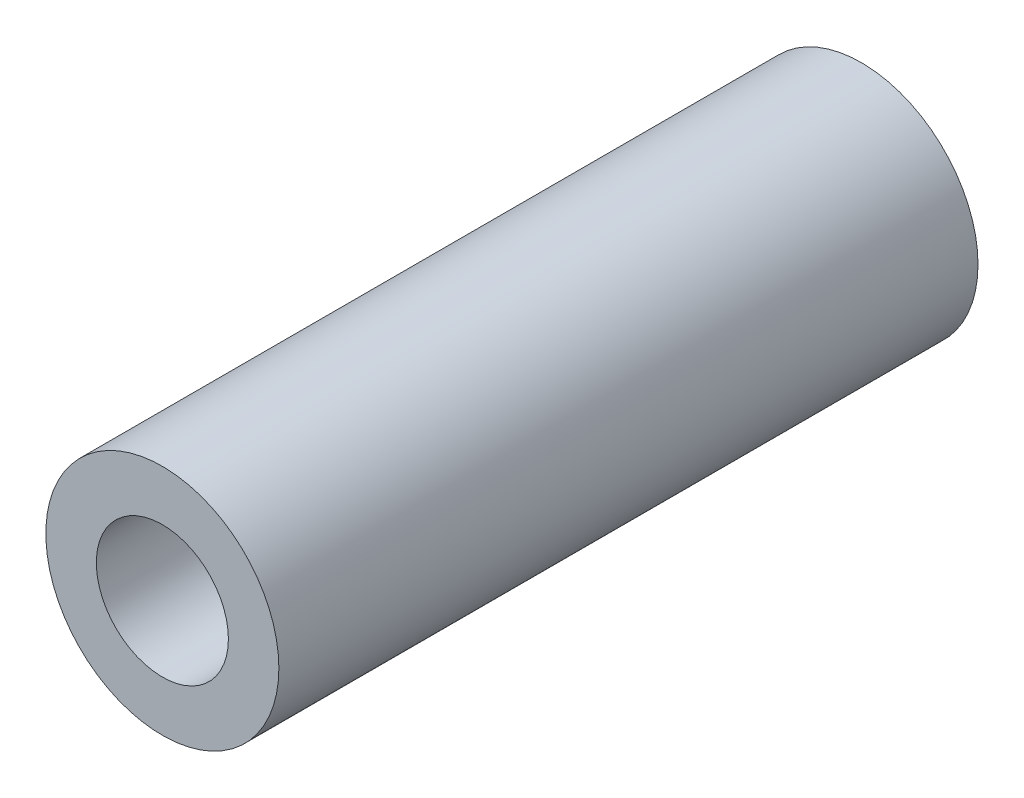
ISO-10303-21;
HEADER;
FILE_DESCRIPTION(('STEP AP214'),'2;1');
FILE_NAME('part.step','',(''),(''),'','','');
FILE_SCHEMA(('AUTOMOTIVE_DESIGN { 1 0 10303 214 1 1 1 1 }'));
ENDSEC;
DATA;
#1=APPLICATION_CONTEXT('core data for automotive mechanical design processes');
#2=APPLICATION_PROTOCOL_DEFINITION('international standard','automotive_design',2000,#1);
#3=PRODUCT_CONTEXT('',#1,'mechanical');
#4=PRODUCT('Part','Part','',(#3));
#5=PRODUCT_RELATED_PRODUCT_CATEGORY('part','',(#4));
#6=PRODUCT_DEFINITION_FORMATION('','',#4);
#7=PRODUCT_DEFINITION_CONTEXT('part definition',#1,'design');
#8=PRODUCT_DEFINITION('design','',#6,#7);
#9=PRODUCT_DEFINITION_SHAPE('','',#8);
#10=(LENGTH_UNIT() NAMED_UNIT(*) SI_UNIT(.MILLI.,.METRE.));
#11=(NAMED_UNIT(*) PLANE_ANGLE_UNIT() SI_UNIT($,.RADIAN.));
#12=(NAMED_UNIT(*) SI_UNIT($,.STERADIAN.) SOLID_ANGLE_UNIT());
#13=UNCERTAINTY_MEASURE_WITH_UNIT(LENGTH_MEASURE(1.E-05),#10,'distance_accuracy_value','');
#14=(GEOMETRIC_REPRESENTATION_CONTEXT(3) GLOBAL_UNCERTAINTY_ASSIGNED_CONTEXT((#13)) GLOBAL_UNIT_ASSIGNED_CONTEXT((#10,
#11,#12)) REPRESENTATION_CONTEXT('',''));
#15=CARTESIAN_POINT('',(0.,0.,0.));
#16=DIRECTION('',(0.,0.,1.));
#17=DIRECTION('',(1.,0.,0.));
#18=AXIS2_PLACEMENT_3D('',#15,#16,#17);
#19=CARTESIAN_POINT('',(-155.,-45.,48.5));
#20=DIRECTION('',(0.,0.,1.));
#21=DIRECTION('',(1.,0.,0.));
#22=AXIS2_PLACEMENT_3D('',#19,#20,#21);
#23=CYLINDRICAL_SURFACE('',#22,3.);
#24=CARTESIAN_POINT('',(-155.,-45.,48.5));
#25=DIRECTION('',(0.,0.,1.));
#26=DIRECTION('',(1.,0.,0.));
#27=AXIS2_PLACEMENT_3D('',#24,#25,#26);
#28=CIRCLE('',#27,3.);
#29=CARTESIAN_POINT('',(-152.,-45.,48.5));
#30=VERTEX_POINT('',#29);
#31=EDGE_CURVE('E10',#30,#30,#28,.T.);
#32=ORIENTED_EDGE('',*,*,#31,.T.);
#33=EDGE_LOOP('',(#32));
#34=FACE_BOUND('',#33,.T.);
#35=CARTESIAN_POINT('',(-155.,-45.,66.5));
#36=DIRECTION('',(0.,0.,1.));
#37=DIRECTION('',(1.,0.,0.));
#38=AXIS2_PLACEMENT_3D('',#35,#36,#37);
#39=CIRCLE('',#38,3.);
#40=CARTESIAN_POINT('',(-152.,-45.,66.5));
#41=VERTEX_POINT('',#40);
#42=EDGE_CURVE('E45',#41,#41,#39,.T.);
#43=ORIENTED_EDGE('',*,*,#42,.F.);
#44=EDGE_LOOP('',(#43));
#45=FACE_BOUND('',#44,.T.);
#46=ADVANCED_FACE('F39',(#34,#45),#23,.T.);
#47=CARTESIAN_POINT('',(-155.,-45.,48.5));
#48=DIRECTION('',(0.,0.,1.));
#49=DIRECTION('',(1.,0.,0.));
#50=AXIS2_PLACEMENT_3D('',#47,#48,#49);
#51=PLANE('',#50);
#52=CARTESIAN_POINT('',(-155.,-45.,48.5));
#53=DIRECTION('',(0.,0.,1.));
#54=DIRECTION('',(1.,0.,0.));
#55=AXIS2_PLACEMENT_3D('',#52,#53,#54);
#56=CIRCLE('',#55,1.70000000000001);
#57=CARTESIAN_POINT('',(-153.3,-45.,48.5));
#58=VERTEX_POINT('',#57);
#59=EDGE_CURVE('E47',#58,#58,#56,.T.);
#60=ORIENTED_EDGE('',*,*,#59,.T.);
#61=EDGE_LOOP('',(#60));
#62=FACE_BOUND('',#61,.T.);
#63=ORIENTED_EDGE('',*,*,#31,.F.);
#64=EDGE_LOOP('',(#63));
#65=FACE_BOUND('',#64,.T.);
#66=ADVANCED_FACE('F60',(#62,#65),#51,.F.);
#67=CARTESIAN_POINT('',(-155.,-45.,66.5));
#68=DIRECTION('',(0.,0.,1.));
#69=DIRECTION('',(1.,0.,0.));
#70=AXIS2_PLACEMENT_3D('',#67,#68,#69);
#71=PLANE('',#70);
#72=CARTESIAN_POINT('',(-155.,-45.,66.5));
#73=DIRECTION('',(0.,0.,1.));
#74=DIRECTION('',(1.,0.,0.));
#75=AXIS2_PLACEMENT_3D('',#72,#73,#74);
#76=CIRCLE('',#75,1.70000000000001);
#77=CARTESIAN_POINT('',(-153.3,-45.,66.5));
#78=VERTEX_POINT('',#77);
#79=EDGE_CURVE('E51',#78,#78,#76,.T.);
#80=ORIENTED_EDGE('',*,*,#79,.F.);
#81=EDGE_LOOP('',(#80));
#82=FACE_BOUND('',#81,.T.);
#83=ORIENTED_EDGE('',*,*,#42,.T.);
#84=EDGE_LOOP('',(#83));
#85=FACE_BOUND('',#84,.T.);
#86=ADVANCED_FACE('F64',(#82,#85),#71,.T.);
#87=CARTESIAN_POINT('',(-155.,-45.,48.5));
#88=DIRECTION('',(0.,0.,1.));
#89=DIRECTION('',(1.,0.,0.));
#90=AXIS2_PLACEMENT_3D('',#87,#88,#89);
#91=CYLINDRICAL_SURFACE('',#90,1.70000000000001);
#92=ORIENTED_EDGE('',*,*,#59,.F.);
#93=EDGE_LOOP('',(#92));
#94=FACE_BOUND('',#93,.T.);
#95=ORIENTED_EDGE('',*,*,#79,.T.);
#96=EDGE_LOOP('',(#95));
#97=FACE_BOUND('',#96,.T.);
#98=ADVANCED_FACE('F58',(#94,#97),#91,.F.);
#99=CLOSED_SHELL('',(#46,#66,#86,#98));
#100=MANIFOLD_SOLID_BREP('B2',#99);
#101=ADVANCED_BREP_SHAPE_REPRESENTATION('',(#18,#100),#14);
#102=SHAPE_DEFINITION_REPRESENTATION(#9,#101);
ENDSEC;
END-ISO-10303-21;
